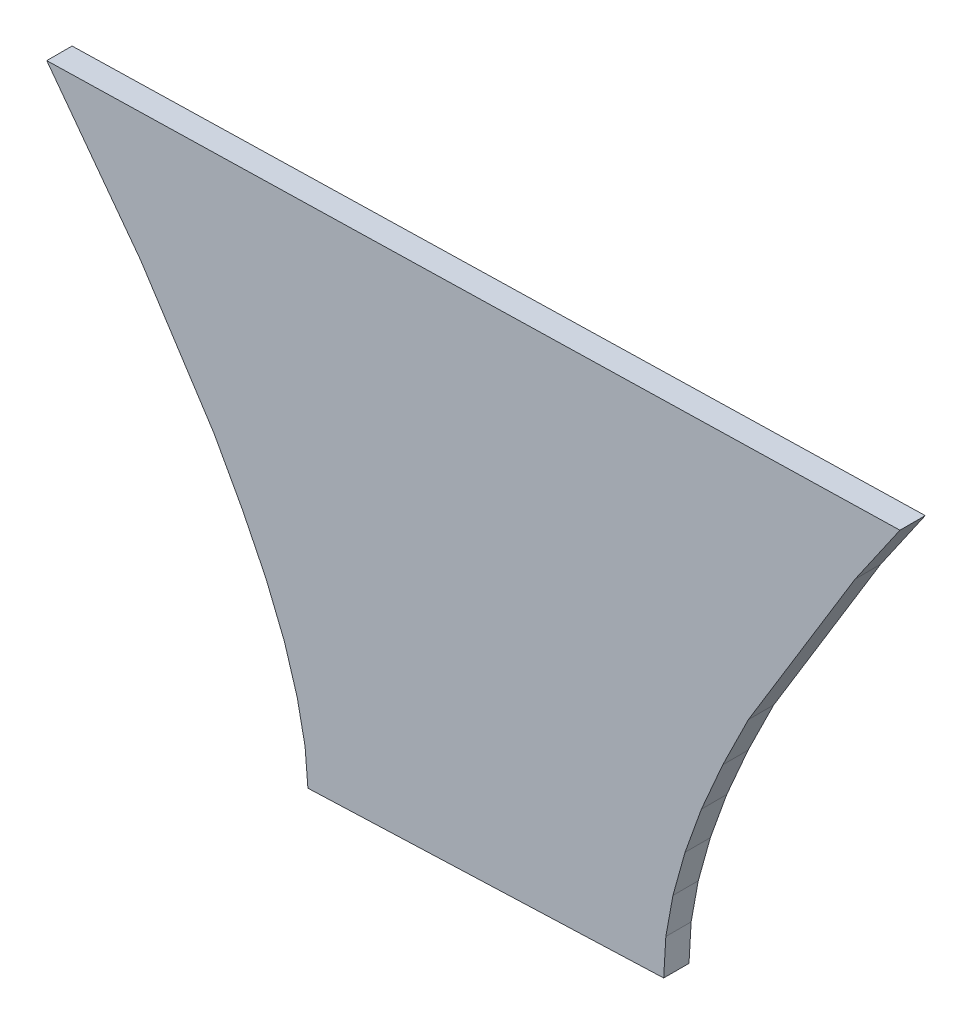
ISO-10303-21;
HEADER;
FILE_DESCRIPTION(('STEP AP214'),'2;1');
FILE_NAME('part.step','',(''),(''),'','','');
FILE_SCHEMA(('AUTOMOTIVE_DESIGN { 1 0 10303 214 1 1 1 1 }'));
ENDSEC;
DATA;
#1=APPLICATION_CONTEXT('core data for automotive mechanical design processes');
#2=APPLICATION_PROTOCOL_DEFINITION('international standard','automotive_design',2000,#1);
#3=PRODUCT_CONTEXT('',#1,'mechanical');
#4=PRODUCT('Part','Part','',(#3));
#5=PRODUCT_RELATED_PRODUCT_CATEGORY('part','',(#4));
#6=PRODUCT_DEFINITION_FORMATION('','',#4);
#7=PRODUCT_DEFINITION_CONTEXT('part definition',#1,'design');
#8=PRODUCT_DEFINITION('design','',#6,#7);
#9=PRODUCT_DEFINITION_SHAPE('','',#8);
#10=(LENGTH_UNIT() NAMED_UNIT(*) SI_UNIT(.MILLI.,.METRE.));
#11=(NAMED_UNIT(*) PLANE_ANGLE_UNIT() SI_UNIT($,.RADIAN.));
#12=(NAMED_UNIT(*) SI_UNIT($,.STERADIAN.) SOLID_ANGLE_UNIT());
#13=UNCERTAINTY_MEASURE_WITH_UNIT(LENGTH_MEASURE(1.E-05),#10,'distance_accuracy_value','');
#14=(GEOMETRIC_REPRESENTATION_CONTEXT(3) GLOBAL_UNCERTAINTY_ASSIGNED_CONTEXT((#13)) GLOBAL_UNIT_ASSIGNED_CONTEXT((#10,
#11,#12)) REPRESENTATION_CONTEXT('',''));
#15=CARTESIAN_POINT('',(0.,0.,0.));
#16=DIRECTION('',(0.,0.,1.));
#17=DIRECTION('',(1.,0.,0.));
#18=AXIS2_PLACEMENT_3D('',#15,#16,#17);
#19=CARTESIAN_POINT('',(50.9290008544922,93.0210037231445,0.));
#20=DIRECTION('',(-0.998341399253956,0.0575712648432582,0.));
#21=DIRECTION('',(0.0575712648432582,0.998341399253956,0.));
#22=AXIS2_PLACEMENT_3D('',#19,#20,#21);
#23=PLANE('',#22);
#24=DIRECTION('',(0.0575712648432582,0.998341399253956,0.));
#25=VECTOR('',#24,1.);
#26=CARTESIAN_POINT('',(50.9290008544922,93.0210037231445,0.03556));
#27=LINE('',#26,#25);
#28=CARTESIAN_POINT('',(50.9290008544922,93.0210037231445,0.03556));
#29=VERTEX_POINT('',#28);
#30=CARTESIAN_POINT('',(50.931999206543,93.072998046875,0.03556));
#31=VERTEX_POINT('',#30);
#32=EDGE_CURVE('E11',#29,#31,#27,.T.);
#33=ORIENTED_EDGE('',*,*,#32,.F.);
#34=DIRECTION('',(0.,0.,1.));
#35=VECTOR('',#34,1.);
#36=CARTESIAN_POINT('',(50.9290008544922,93.0210037231445,0.));
#37=LINE('',#36,#35);
#38=CARTESIAN_POINT('',(50.9290008544922,93.0210037231445,0.));
#39=VERTEX_POINT('',#38);
#40=EDGE_CURVE('E24',#39,#29,#37,.T.);
#41=ORIENTED_EDGE('',*,*,#40,.F.);
#42=DIRECTION('',(0.0575712648432582,0.998341399253956,0.));
#43=VECTOR('',#42,1.);
#44=CARTESIAN_POINT('',(50.9290008544922,93.0210037231445,0.));
#45=LINE('',#44,#43);
#46=CARTESIAN_POINT('',(50.931999206543,93.072998046875,0.));
#47=VERTEX_POINT('',#46);
#48=EDGE_CURVE('E160',#39,#47,#45,.T.);
#49=ORIENTED_EDGE('',*,*,#48,.T.);
#50=DIRECTION('',(0.,0.,1.));
#51=VECTOR('',#50,1.);
#52=CARTESIAN_POINT('',(50.931999206543,93.072998046875,0.));
#53=LINE('',#52,#51);
#54=EDGE_CURVE('E37',#47,#31,#53,.T.);
#55=ORIENTED_EDGE('',*,*,#54,.T.);
#56=EDGE_LOOP('',(#33,#41,#49,#55));
#57=FACE_BOUND('',#56,.T.);
#58=ADVANCED_FACE('F17',(#57),#23,.F.);
#59=CARTESIAN_POINT('',(50.931999206543,93.072998046875,0.));
#60=DIRECTION('',(-0.983863358539756,0.178921468032407,0.));
#61=DIRECTION('',(0.178921468032407,0.983863358539756,0.));
#62=AXIS2_PLACEMENT_3D('',#59,#60,#61);
#63=PLANE('',#62);
#64=DIRECTION('',(0.178921468032407,0.983863358539756,0.));
#65=VECTOR('',#64,1.);
#66=CARTESIAN_POINT('',(50.931999206543,93.072998046875,0.03556));
#67=LINE('',#66,#65);
#68=CARTESIAN_POINT('',(50.9420013427734,93.1279983520508,0.03556));
#69=VERTEX_POINT('',#68);
#70=EDGE_CURVE('E280',#31,#69,#67,.T.);
#71=ORIENTED_EDGE('',*,*,#70,.F.);
#72=ORIENTED_EDGE('',*,*,#54,.F.);
#73=DIRECTION('',(0.178921468032407,0.983863358539756,0.));
#74=VECTOR('',#73,1.);
#75=CARTESIAN_POINT('',(50.931999206543,93.072998046875,0.));
#76=LINE('',#75,#74);
#77=CARTESIAN_POINT('',(50.9420013427734,93.1279983520508,0.));
#78=VERTEX_POINT('',#77);
#79=EDGE_CURVE('E277',#47,#78,#76,.T.);
#80=ORIENTED_EDGE('',*,*,#79,.T.);
#81=DIRECTION('',(0.,0.,1.));
#82=VECTOR('',#81,1.);
#83=CARTESIAN_POINT('',(50.9420013427734,93.1279983520508,0.));
#84=LINE('',#83,#82);
#85=EDGE_CURVE('E275',#78,#69,#84,.T.);
#86=ORIENTED_EDGE('',*,*,#85,.T.);
#87=EDGE_LOOP('',(#71,#72,#80,#86));
#88=FACE_BOUND('',#87,.T.);
#89=ADVANCED_FACE('F288',(#88),#63,.F.);
#90=CARTESIAN_POINT('',(50.9420013427734,93.1279983520508,0.));
#91=DIRECTION('',(-0.963303580445279,0.268414254281151,0.));
#92=DIRECTION('',(0.268414254281151,0.963303580445279,0.));
#93=AXIS2_PLACEMENT_3D('',#90,#91,#92);
#94=PLANE('',#93);
#95=DIRECTION('',(0.268414254281151,0.963303580445279,0.));
#96=VECTOR('',#95,1.);
#97=CARTESIAN_POINT('',(50.9420013427734,93.1279983520508,0.03556));
#98=LINE('',#97,#96);
#99=CARTESIAN_POINT('',(50.9589996337891,93.1890029907227,0.03556));
#100=VERTEX_POINT('',#99);
#101=EDGE_CURVE('E272',#69,#100,#98,.T.);
#102=ORIENTED_EDGE('',*,*,#101,.F.);
#103=ORIENTED_EDGE('',*,*,#85,.F.);
#104=DIRECTION('',(0.268414254281151,0.963303580445279,0.));
#105=VECTOR('',#104,1.);
#106=CARTESIAN_POINT('',(50.9420013427734,93.1279983520508,0.));
#107=LINE('',#106,#105);
#108=CARTESIAN_POINT('',(50.9589996337891,93.1890029907227,0.));
#109=VERTEX_POINT('',#108);
#110=EDGE_CURVE('E269',#78,#109,#107,.T.);
#111=ORIENTED_EDGE('',*,*,#110,.T.);
#112=DIRECTION('',(0.,0.,1.));
#113=VECTOR('',#112,1.);
#114=CARTESIAN_POINT('',(50.9589996337891,93.1890029907227,0.));
#115=LINE('',#114,#113);
#116=EDGE_CURVE('E267',#109,#100,#115,.T.);
#117=ORIENTED_EDGE('',*,*,#116,.T.);
#118=EDGE_LOOP('',(#102,#103,#111,#117));
#119=FACE_BOUND('',#118,.T.);
#120=ADVANCED_FACE('F294',(#119),#94,.F.);
#121=CARTESIAN_POINT('',(50.9589996337891,93.1890029907227,0.));
#122=DIRECTION('',(-0.941072484534248,0.338204936174117,0.));
#123=DIRECTION('',(0.338204936174117,0.941072484534248,0.));
#124=AXIS2_PLACEMENT_3D('',#121,#122,#123);
#125=PLANE('',#124);
#126=DIRECTION('',(0.338204936174117,0.941072484534248,0.));
#127=VECTOR('',#126,1.);
#128=CARTESIAN_POINT('',(50.9589996337891,93.1890029907227,0.03556));
#129=LINE('',#128,#127);
#130=CARTESIAN_POINT('',(50.9819984436035,93.2529983520508,0.03556));
#131=VERTEX_POINT('',#130);
#132=EDGE_CURVE('E264',#100,#131,#129,.T.);
#133=ORIENTED_EDGE('',*,*,#132,.F.);
#134=ORIENTED_EDGE('',*,*,#116,.F.);
#135=DIRECTION('',(0.338204936174117,0.941072484534248,0.));
#136=VECTOR('',#135,1.);
#137=CARTESIAN_POINT('',(50.9589996337891,93.1890029907227,0.));
#138=LINE('',#137,#136);
#139=CARTESIAN_POINT('',(50.9819984436035,93.2529983520508,0.));
#140=VERTEX_POINT('',#139);
#141=EDGE_CURVE('E261',#109,#140,#138,.T.);
#142=ORIENTED_EDGE('',*,*,#141,.T.);
#143=DIRECTION('',(0.,0.,1.));
#144=VECTOR('',#143,1.);
#145=CARTESIAN_POINT('',(50.9819984436035,93.2529983520508,0.));
#146=LINE('',#145,#144);
#147=EDGE_CURVE('E259',#140,#131,#146,.T.);
#148=ORIENTED_EDGE('',*,*,#147,.T.);
#149=EDGE_LOOP('',(#133,#134,#142,#148));
#150=FACE_BOUND('',#149,.T.);
#151=ADVANCED_FACE('F296',(#150),#125,.F.);
#152=CARTESIAN_POINT('',(50.9819984436035,93.2529983520508,0.));
#153=DIRECTION('',(-0.917057965259508,0.398753919546994,0.));
#154=DIRECTION('',(0.398753919546994,0.917057965259508,0.));
#155=AXIS2_PLACEMENT_3D('',#152,#153,#154);
#156=PLANE('',#155);
#157=DIRECTION('',(0.398753919546994,0.917057965259508,0.));
#158=VECTOR('',#157,1.);
#159=CARTESIAN_POINT('',(50.9819984436035,93.2529983520508,0.03556));
#160=LINE('',#159,#158);
#161=CARTESIAN_POINT('',(51.0120010375977,93.3219985961914,0.03556));
#162=VERTEX_POINT('',#161);
#163=EDGE_CURVE('E256',#131,#162,#160,.T.);
#164=ORIENTED_EDGE('',*,*,#163,.F.);
#165=ORIENTED_EDGE('',*,*,#147,.F.);
#166=DIRECTION('',(0.398753919546994,0.917057965259508,0.));
#167=VECTOR('',#166,1.);
#168=CARTESIAN_POINT('',(50.9819984436035,93.2529983520508,0.));
#169=LINE('',#168,#167);
#170=CARTESIAN_POINT('',(51.0120010375977,93.3219985961914,0.));
#171=VERTEX_POINT('',#170);
#172=EDGE_CURVE('E253',#140,#171,#169,.T.);
#173=ORIENTED_EDGE('',*,*,#172,.T.);
#174=DIRECTION('',(0.,0.,1.));
#175=VECTOR('',#174,1.);
#176=CARTESIAN_POINT('',(51.0120010375977,93.3219985961914,0.));
#177=LINE('',#176,#175);
#178=EDGE_CURVE('E251',#171,#162,#177,.T.);
#179=ORIENTED_EDGE('',*,*,#178,.T.);
#180=EDGE_LOOP('',(#164,#165,#173,#179));
#181=FACE_BOUND('',#180,.T.);
#182=ADVANCED_FACE('F301',(#181),#156,.F.);
#183=CARTESIAN_POINT('',(51.0120010375977,93.3219985961914,0.));
#184=DIRECTION('',(-0.896869597174095,0.44229506629034,0.));
#185=DIRECTION('',(0.44229506629034,0.896869597174095,0.));
#186=AXIS2_PLACEMENT_3D('',#183,#184,#185);
#187=PLANE('',#186);
#188=DIRECTION('',(0.44229506629034,0.896869597174095,0.));
#189=VECTOR('',#188,1.);
#190=CARTESIAN_POINT('',(51.0120010375977,93.3219985961914,0.03556));
#191=LINE('',#190,#189);
#192=CARTESIAN_POINT('',(51.0480003356934,93.3949966430664,0.03556));
#193=VERTEX_POINT('',#192);
#194=EDGE_CURVE('E248',#162,#193,#191,.T.);
#195=ORIENTED_EDGE('',*,*,#194,.F.);
#196=ORIENTED_EDGE('',*,*,#178,.F.);
#197=DIRECTION('',(0.44229506629034,0.896869597174095,0.));
#198=VECTOR('',#197,1.);
#199=CARTESIAN_POINT('',(51.0120010375977,93.3219985961914,0.));
#200=LINE('',#199,#198);
#201=CARTESIAN_POINT('',(51.0480003356934,93.3949966430664,0.));
#202=VERTEX_POINT('',#201);
#203=EDGE_CURVE('E245',#171,#202,#200,.T.);
#204=ORIENTED_EDGE('',*,*,#203,.T.);
#205=DIRECTION('',(0.,0.,1.));
#206=VECTOR('',#205,1.);
#207=CARTESIAN_POINT('',(51.0480003356934,93.3949966430664,0.));
#208=LINE('',#207,#206);
#209=EDGE_CURVE('E243',#202,#193,#208,.T.);
#210=ORIENTED_EDGE('',*,*,#209,.T.);
#211=EDGE_LOOP('',(#195,#196,#204,#210));
#212=FACE_BOUND('',#211,.T.);
#213=ADVANCED_FACE('F304',(#212),#187,.F.);
#214=CARTESIAN_POINT('',(51.0480003356934,93.3949966430664,0.));
#215=DIRECTION('',(-0.8537958887252,0.520607895057256,0.));
#216=DIRECTION('',(0.520607895057256,0.8537958887252,0.));
#217=AXIS2_PLACEMENT_3D('',#214,#215,#216);
#218=PLANE('',#217);
#219=DIRECTION('',(0.520607895057256,0.8537958887252,0.));
#220=VECTOR('',#219,1.);
#221=CARTESIAN_POINT('',(51.0480003356934,93.3949966430664,0.03556));
#222=LINE('',#221,#220);
#223=CARTESIAN_POINT('',(51.1980018615723,93.640998840332,0.03556));
#224=VERTEX_POINT('',#223);
#225=EDGE_CURVE('E240',#193,#224,#222,.T.);
#226=ORIENTED_EDGE('',*,*,#225,.F.);
#227=ORIENTED_EDGE('',*,*,#209,.F.);
#228=DIRECTION('',(0.520607895057256,0.8537958887252,0.));
#229=VECTOR('',#228,1.);
#230=CARTESIAN_POINT('',(51.0480003356934,93.3949966430664,0.));
#231=LINE('',#230,#229);
#232=CARTESIAN_POINT('',(51.1980018615723,93.640998840332,0.));
#233=VERTEX_POINT('',#232);
#234=EDGE_CURVE('E237',#202,#233,#231,.T.);
#235=ORIENTED_EDGE('',*,*,#234,.T.);
#236=DIRECTION('',(0.,0.,1.));
#237=VECTOR('',#236,1.);
#238=CARTESIAN_POINT('',(51.1980018615723,93.640998840332,0.));
#239=LINE('',#238,#237);
#240=EDGE_CURVE('E235',#233,#224,#239,.T.);
#241=ORIENTED_EDGE('',*,*,#240,.T.);
#242=EDGE_LOOP('',(#226,#227,#235,#241));
#243=FACE_BOUND('',#242,.T.);
#244=ADVANCED_FACE('F309',(#243),#218,.F.);
#245=CARTESIAN_POINT('',(51.1980018615723,93.640998840332,0.));
#246=DIRECTION('',(-0.822203358231373,0.569193848976825,0.));
#247=DIRECTION('',(0.569193848976825,0.822203358231373,0.));
#248=AXIS2_PLACEMENT_3D('',#245,#246,#247);
#249=PLANE('',#248);
#250=DIRECTION('',(0.569193848976825,0.822203358231373,0.));
#251=VECTOR('',#250,1.);
#252=CARTESIAN_POINT('',(51.1980018615723,93.640998840332,0.03556));
#253=LINE('',#252,#251);
#254=CARTESIAN_POINT('',(51.2610015869141,93.7320022583008,0.03556));
#255=VERTEX_POINT('',#254);
#256=EDGE_CURVE('E232',#224,#255,#253,.T.);
#257=ORIENTED_EDGE('',*,*,#256,.F.);
#258=ORIENTED_EDGE('',*,*,#240,.F.);
#259=DIRECTION('',(0.569193848976825,0.822203358231373,0.));
#260=VECTOR('',#259,1.);
#261=CARTESIAN_POINT('',(51.1980018615723,93.640998840332,0.));
#262=LINE('',#261,#260);
#263=CARTESIAN_POINT('',(51.2610015869141,93.7320022583008,0.));
#264=VERTEX_POINT('',#263);
#265=EDGE_CURVE('E229',#233,#264,#262,.T.);
#266=ORIENTED_EDGE('',*,*,#265,.T.);
#267=DIRECTION('',(0.,0.,1.));
#268=VECTOR('',#267,1.);
#269=CARTESIAN_POINT('',(51.2610015869141,93.7320022583008,0.));
#270=LINE('',#269,#268);
#271=EDGE_CURVE('E227',#264,#255,#270,.T.);
#272=ORIENTED_EDGE('',*,*,#271,.T.);
#273=EDGE_LOOP('',(#257,#258,#266,#272));
#274=FACE_BOUND('',#273,.T.);
#275=ADVANCED_FACE('F312',(#274),#249,.F.);
#276=CARTESIAN_POINT('',(51.2610015869141,93.7320022583008,0.));
#277=DIRECTION('',(0.0233463015758261,-0.999727437956331,0.));
#278=DIRECTION('',(-0.999727437956331,-0.0233463015758261,0.));
#279=AXIS2_PLACEMENT_3D('',#276,#277,#278);
#280=PLANE('',#279);
#281=DIRECTION('',(-0.999727437956331,-0.0233463015758261,0.));
#282=VECTOR('',#281,1.);
#283=CARTESIAN_POINT('',(51.2610015869141,93.7320022583008,0.03556));
#284=LINE('',#283,#282);
#285=CARTESIAN_POINT('',(50.0620002746582,93.7040023803711,0.03556));
#286=VERTEX_POINT('',#285);
#287=EDGE_CURVE('E224',#255,#286,#284,.T.);
#288=ORIENTED_EDGE('',*,*,#287,.F.);
#289=ORIENTED_EDGE('',*,*,#271,.F.);
#290=DIRECTION('',(-0.999727437956331,-0.0233463015758261,0.));
#291=VECTOR('',#290,1.);
#292=CARTESIAN_POINT('',(51.2610015869141,93.7320022583008,0.));
#293=LINE('',#292,#291);
#294=CARTESIAN_POINT('',(50.0620002746582,93.7040023803711,0.));
#295=VERTEX_POINT('',#294);
#296=EDGE_CURVE('E221',#264,#295,#293,.T.);
#297=ORIENTED_EDGE('',*,*,#296,.T.);
#298=DIRECTION('',(0.,0.,1.));
#299=VECTOR('',#298,1.);
#300=CARTESIAN_POINT('',(50.0620002746582,93.7040023803711,0.));
#301=LINE('',#300,#299);
#302=EDGE_CURVE('E219',#295,#286,#301,.T.);
#303=ORIENTED_EDGE('',*,*,#302,.T.);
#304=EDGE_LOOP('',(#288,#289,#297,#303));
#305=FACE_BOUND('',#304,.T.);
#306=ADVANCED_FACE('F317',(#305),#280,.F.);
#307=CARTESIAN_POINT('',(50.0620002746582,93.7040023803711,0.));
#308=DIRECTION('',(0.80163070266898,0.597819551820144,0.));
#309=DIRECTION('',(0.597819551820144,-0.80163070266898,0.));
#310=AXIS2_PLACEMENT_3D('',#307,#308,#309);
#311=PLANE('',#310);
#312=DIRECTION('',(0.597819551820144,-0.80163070266898,0.));
#313=VECTOR('',#312,1.);
#314=CARTESIAN_POINT('',(50.0620002746582,93.7040023803711,0.03556));
#315=LINE('',#314,#313);
#316=CARTESIAN_POINT('',(50.1940002441406,93.5270004272461,0.03556));
#317=VERTEX_POINT('',#316);
#318=EDGE_CURVE('E216',#286,#317,#315,.T.);
#319=ORIENTED_EDGE('',*,*,#318,.F.);
#320=ORIENTED_EDGE('',*,*,#302,.F.);
#321=DIRECTION('',(0.597819551820144,-0.80163070266898,0.));
#322=VECTOR('',#321,1.);
#323=CARTESIAN_POINT('',(50.0620002746582,93.7040023803711,0.));
#324=LINE('',#323,#322);
#325=CARTESIAN_POINT('',(50.1940002441406,93.5270004272461,0.));
#326=VERTEX_POINT('',#325);
#327=EDGE_CURVE('E213',#295,#326,#324,.T.);
#328=ORIENTED_EDGE('',*,*,#327,.T.);
#329=DIRECTION('',(0.,0.,1.));
#330=VECTOR('',#329,1.);
#331=CARTESIAN_POINT('',(50.1940002441406,93.5270004272461,0.));
#332=LINE('',#331,#330);
#333=EDGE_CURVE('E211',#326,#317,#332,.T.);
#334=ORIENTED_EDGE('',*,*,#333,.T.);
#335=EDGE_LOOP('',(#319,#320,#328,#334));
#336=FACE_BOUND('',#335,.T.);
#337=ADVANCED_FACE('F320',(#336),#311,.F.);
#338=CARTESIAN_POINT('',(50.1940002441406,93.5270004272461,0.));
#339=DIRECTION('',(0.839291832075735,0.543681175516456,0.));
#340=DIRECTION('',(0.543681175516456,-0.839291832075735,0.));
#341=AXIS2_PLACEMENT_3D('',#338,#339,#340);
#342=PLANE('',#341);
#343=DIRECTION('',(0.543681175516456,-0.839291832075735,0.));
#344=VECTOR('',#343,1.);
#345=CARTESIAN_POINT('',(50.1940002441406,93.5270004272461,0.03556));
#346=LINE('',#345,#344);
#347=CARTESIAN_POINT('',(50.2970008850098,93.3679962158203,0.03556));
#348=VERTEX_POINT('',#347);
#349=EDGE_CURVE('E208',#317,#348,#346,.T.);
#350=ORIENTED_EDGE('',*,*,#349,.F.);
#351=ORIENTED_EDGE('',*,*,#333,.F.);
#352=DIRECTION('',(0.543681175516456,-0.839291832075735,0.));
#353=VECTOR('',#352,1.);
#354=CARTESIAN_POINT('',(50.1940002441406,93.5270004272461,0.));
#355=LINE('',#354,#353);
#356=CARTESIAN_POINT('',(50.2970008850098,93.3679962158203,0.));
#357=VERTEX_POINT('',#356);
#358=EDGE_CURVE('E205',#326,#357,#355,.T.);
#359=ORIENTED_EDGE('',*,*,#358,.T.);
#360=DIRECTION('',(0.,0.,1.));
#361=VECTOR('',#360,1.);
#362=CARTESIAN_POINT('',(50.2970008850098,93.3679962158203,0.));
#363=LINE('',#362,#361);
#364=EDGE_CURVE('E203',#357,#348,#363,.T.);
#365=ORIENTED_EDGE('',*,*,#364,.T.);
#366=EDGE_LOOP('',(#350,#351,#359,#365));
#367=FACE_BOUND('',#366,.T.);
#368=ADVANCED_FACE('F325',(#367),#342,.F.);
#369=CARTESIAN_POINT('',(50.2970008850098,93.3679962158203,0.));
#370=DIRECTION('',(0.876965686440801,0.480552998955803,0.));
#371=DIRECTION('',(0.480552998955803,-0.876965686440801,0.));
#372=AXIS2_PLACEMENT_3D('',#369,#370,#371);
#373=PLANE('',#372);
#374=DIRECTION('',(0.480552998955802,-0.876965686440801,0.));
#375=VECTOR('',#374,1.);
#376=CARTESIAN_POINT('',(50.2970008850098,93.3679962158203,0.03556));
#377=LINE('',#376,#375);
#378=CARTESIAN_POINT('',(50.3370018005371,93.2949981689453,0.03556));
#379=VERTEX_POINT('',#378);
#380=EDGE_CURVE('E200',#348,#379,#377,.T.);
#381=ORIENTED_EDGE('',*,*,#380,.F.);
#382=ORIENTED_EDGE('',*,*,#364,.F.);
#383=DIRECTION('',(0.480552998955802,-0.876965686440801,0.));
#384=VECTOR('',#383,1.);
#385=CARTESIAN_POINT('',(50.2970008850098,93.3679962158203,0.));
#386=LINE('',#385,#384);
#387=CARTESIAN_POINT('',(50.3370018005371,93.2949981689453,0.));
#388=VERTEX_POINT('',#387);
#389=EDGE_CURVE('E197',#357,#388,#386,.T.);
#390=ORIENTED_EDGE('',*,*,#389,.T.);
#391=DIRECTION('',(0.,0.,1.));
#392=VECTOR('',#391,1.);
#393=CARTESIAN_POINT('',(50.3370018005371,93.2949981689453,0.));
#394=LINE('',#393,#392);
#395=EDGE_CURVE('E195',#388,#379,#394,.T.);
#396=ORIENTED_EDGE('',*,*,#395,.T.);
#397=EDGE_LOOP('',(#381,#382,#390,#396));
#398=FACE_BOUND('',#397,.T.);
#399=ADVANCED_FACE('F328',(#398),#373,.F.);
#400=CARTESIAN_POINT('',(50.3370018005371,93.2949981689453,0.));
#401=DIRECTION('',(0.897107767621295,0.441811784896618,0.));
#402=DIRECTION('',(0.441811784896618,-0.897107767621295,0.));
#403=AXIS2_PLACEMENT_3D('',#400,#401,#402);
#404=PLANE('',#403);
#405=DIRECTION('',(0.441811784896618,-0.897107767621295,0.));
#406=VECTOR('',#405,1.);
#407=CARTESIAN_POINT('',(50.3370018005371,93.2949981689453,0.03556));
#408=LINE('',#407,#406);
#409=CARTESIAN_POINT('',(50.3699989318848,93.2279968261719,0.03556));
#410=VERTEX_POINT('',#409);
#411=EDGE_CURVE('E192',#379,#410,#408,.T.);
#412=ORIENTED_EDGE('',*,*,#411,.F.);
#413=ORIENTED_EDGE('',*,*,#395,.F.);
#414=DIRECTION('',(0.441811784896618,-0.897107767621295,0.));
#415=VECTOR('',#414,1.);
#416=CARTESIAN_POINT('',(50.3370018005371,93.2949981689453,0.));
#417=LINE('',#416,#415);
#418=CARTESIAN_POINT('',(50.3699989318848,93.2279968261719,0.));
#419=VERTEX_POINT('',#418);
#420=EDGE_CURVE('E189',#388,#419,#417,.T.);
#421=ORIENTED_EDGE('',*,*,#420,.T.);
#422=DIRECTION('',(0.,0.,1.));
#423=VECTOR('',#422,1.);
#424=CARTESIAN_POINT('',(50.3699989318848,93.2279968261719,0.));
#425=LINE('',#424,#423);
#426=EDGE_CURVE('E187',#419,#410,#425,.T.);
#427=ORIENTED_EDGE('',*,*,#426,.T.);
#428=EDGE_LOOP('',(#412,#413,#421,#427));
#429=FACE_BOUND('',#428,.T.);
#430=ADVANCED_FACE('F333',(#429),#404,.F.);
#431=CARTESIAN_POINT('',(50.3699989318848,93.2279968261719,0.));
#432=DIRECTION('',(0.926452133729281,0.376412597967261,0.));
#433=DIRECTION('',(0.376412597967261,-0.926452133729281,0.));
#434=AXIS2_PLACEMENT_3D('',#431,#432,#433);
#435=PLANE('',#434);
#436=DIRECTION('',(0.376412597967261,-0.926452133729281,0.));
#437=VECTOR('',#436,1.);
#438=CARTESIAN_POINT('',(50.3699989318848,93.2279968261719,0.03556));
#439=LINE('',#438,#437);
#440=CARTESIAN_POINT('',(50.3959999084473,93.1640014648438,0.03556));
#441=VERTEX_POINT('',#440);
#442=EDGE_CURVE('E184',#410,#441,#439,.T.);
#443=ORIENTED_EDGE('',*,*,#442,.F.);
#444=ORIENTED_EDGE('',*,*,#426,.F.);
#445=DIRECTION('',(0.376412597967261,-0.926452133729281,0.));
#446=VECTOR('',#445,1.);
#447=CARTESIAN_POINT('',(50.3699989318848,93.2279968261719,0.));
#448=LINE('',#447,#446);
#449=CARTESIAN_POINT('',(50.3959999084473,93.1640014648438,0.));
#450=VERTEX_POINT('',#449);
#451=EDGE_CURVE('E181',#419,#450,#448,.T.);
#452=ORIENTED_EDGE('',*,*,#451,.T.);
#453=DIRECTION('',(0.,0.,1.));
#454=VECTOR('',#453,1.);
#455=CARTESIAN_POINT('',(50.3959999084473,93.1640014648438,0.));
#456=LINE('',#455,#454);
#457=EDGE_CURVE('E179',#450,#441,#456,.T.);
#458=ORIENTED_EDGE('',*,*,#457,.T.);
#459=EDGE_LOOP('',(#443,#444,#452,#458));
#460=FACE_BOUND('',#459,.T.);
#461=ADVANCED_FACE('F336',(#460),#435,.F.);
#462=CARTESIAN_POINT('',(50.3959999084473,93.1640014648438,0.));
#463=DIRECTION('',(0.956467675231401,0.291838287819538,0.));
#464=DIRECTION('',(0.291838287819538,-0.956467675231401,0.));
#465=AXIS2_PLACEMENT_3D('',#462,#463,#464);
#466=PLANE('',#465);
#467=DIRECTION('',(0.291838287819538,-0.956467675231401,0.));
#468=VECTOR('',#467,1.);
#469=CARTESIAN_POINT('',(50.3959999084473,93.1640014648438,0.03556));
#470=LINE('',#469,#468);
#471=CARTESIAN_POINT('',(50.4140014648438,93.1050033569336,0.03556));
#472=VERTEX_POINT('',#471);
#473=EDGE_CURVE('E176',#441,#472,#470,.T.);
#474=ORIENTED_EDGE('',*,*,#473,.F.);
#475=ORIENTED_EDGE('',*,*,#457,.F.);
#476=DIRECTION('',(0.291838287819538,-0.956467675231401,0.));
#477=VECTOR('',#476,1.);
#478=CARTESIAN_POINT('',(50.3959999084473,93.1640014648438,0.));
#479=LINE('',#478,#477);
#480=CARTESIAN_POINT('',(50.4140014648438,93.1050033569336,0.));
#481=VERTEX_POINT('',#480);
#482=EDGE_CURVE('E173',#450,#481,#479,.T.);
#483=ORIENTED_EDGE('',*,*,#482,.T.);
#484=DIRECTION('',(0.,0.,1.));
#485=VECTOR('',#484,1.);
#486=CARTESIAN_POINT('',(50.4140014648438,93.1050033569336,0.));
#487=LINE('',#486,#485);
#488=EDGE_CURVE('E171',#481,#472,#487,.T.);
#489=ORIENTED_EDGE('',*,*,#488,.T.);
#490=EDGE_LOOP('',(#474,#475,#483,#489));
#491=FACE_BOUND('',#490,.T.);
#492=ADVANCED_FACE('F341',(#491),#466,.F.);
#493=CARTESIAN_POINT('',(50.4140014648438,93.1050033569336,0.));
#494=DIRECTION('',(0.979885072166908,0.199562635141085,0.));
#495=DIRECTION('',(0.199562635141085,-0.979885072166908,0.));
#496=AXIS2_PLACEMENT_3D('',#493,#494,#495);
#497=PLANE('',#496);
#498=DIRECTION('',(0.199562635141085,-0.979885072166908,0.));
#499=VECTOR('',#498,1.);
#500=CARTESIAN_POINT('',(50.4140014648438,93.1050033569336,0.03556));
#501=LINE('',#500,#499);
#502=CARTESIAN_POINT('',(50.4249992370605,93.0510025024414,0.03556));
#503=VERTEX_POINT('',#502);
#504=EDGE_CURVE('E168',#472,#503,#501,.T.);
#505=ORIENTED_EDGE('',*,*,#504,.F.);
#506=ORIENTED_EDGE('',*,*,#488,.F.);
#507=DIRECTION('',(0.199562635141085,-0.979885072166908,0.));
#508=VECTOR('',#507,1.);
#509=CARTESIAN_POINT('',(50.4140014648438,93.1050033569336,0.));
#510=LINE('',#509,#508);
#511=CARTESIAN_POINT('',(50.4249992370605,93.0510025024414,0.));
#512=VERTEX_POINT('',#511);
#513=EDGE_CURVE('E166',#481,#512,#510,.T.);
#514=ORIENTED_EDGE('',*,*,#513,.T.);
#515=DIRECTION('',(0.,0.,1.));
#516=VECTOR('',#515,1.);
#517=CARTESIAN_POINT('',(50.4249992370605,93.0510025024414,0.));
#518=LINE('',#517,#516);
#519=EDGE_CURVE('E151',#512,#503,#518,.T.);
#520=ORIENTED_EDGE('',*,*,#519,.T.);
#521=EDGE_LOOP('',(#505,#506,#514,#520));
#522=FACE_BOUND('',#521,.T.);
#523=ADVANCED_FACE('F343',(#522),#497,.F.);
#524=CARTESIAN_POINT('',(50.4249992370605,93.0510025024414,0.));
#525=DIRECTION('',(0.996682432627709,0.0813887491691162,0.));
#526=DIRECTION('',(0.0813887491691162,-0.996682432627709,0.));
#527=AXIS2_PLACEMENT_3D('',#524,#525,#526);
#528=PLANE('',#527);
#529=DIRECTION('',(0.0813887491691162,-0.996682432627709,0.));
#530=VECTOR('',#529,1.);
#531=CARTESIAN_POINT('',(50.4249992370605,93.0510025024414,0.03556));
#532=LINE('',#531,#530);
#533=CARTESIAN_POINT('',(50.4290008544922,93.0019989013672,0.03556));
#534=VERTEX_POINT('',#533);
#535=EDGE_CURVE('E155',#503,#534,#532,.T.);
#536=ORIENTED_EDGE('',*,*,#535,.F.);
#537=ORIENTED_EDGE('',*,*,#519,.F.);
#538=DIRECTION('',(0.0813887491691162,-0.996682432627709,0.));
#539=VECTOR('',#538,1.);
#540=CARTESIAN_POINT('',(50.4249992370605,93.0510025024414,0.));
#541=LINE('',#540,#539);
#542=CARTESIAN_POINT('',(50.4290008544922,93.0019989013672,0.));
#543=VERTEX_POINT('',#542);
#544=EDGE_CURVE('E147',#512,#543,#541,.T.);
#545=ORIENTED_EDGE('',*,*,#544,.T.);
#546=DIRECTION('',(0.,0.,1.));
#547=VECTOR('',#546,1.);
#548=CARTESIAN_POINT('',(50.4290008544922,93.0019989013672,0.));
#549=LINE('',#548,#547);
#550=EDGE_CURVE('E137',#543,#534,#549,.T.);
#551=ORIENTED_EDGE('',*,*,#550,.T.);
#552=EDGE_LOOP('',(#536,#537,#545,#551));
#553=FACE_BOUND('',#552,.T.);
#554=ADVANCED_FACE('F150',(#553),#528,.F.);
#555=CARTESIAN_POINT('',(50.4290008544922,93.0019989013672,0.));
#556=DIRECTION('',(-0.0379822163765834,0.999278415277305,0.));
#557=DIRECTION('',(0.999278415277305,0.0379822163765834,0.));
#558=AXIS2_PLACEMENT_3D('',#555,#556,#557);
#559=PLANE('',#558);
#560=DIRECTION('',(0.999278415277305,0.0379822163765834,0.));
#561=VECTOR('',#560,1.);
#562=CARTESIAN_POINT('',(50.4290008544922,93.0019989013672,0.03556));
#563=LINE('',#562,#561);
#564=EDGE_CURVE('E143',#534,#29,#563,.T.);
#565=ORIENTED_EDGE('',*,*,#564,.F.);
#566=ORIENTED_EDGE('',*,*,#550,.F.);
#567=DIRECTION('',(0.999278415277305,0.0379822163765834,0.));
#568=VECTOR('',#567,1.);
#569=CARTESIAN_POINT('',(50.4290008544922,93.0019989013672,0.));
#570=LINE('',#569,#568);
#571=EDGE_CURVE('E141',#543,#39,#570,.T.);
#572=ORIENTED_EDGE('',*,*,#571,.T.);
#573=ORIENTED_EDGE('',*,*,#40,.T.);
#574=EDGE_LOOP('',(#565,#566,#572,#573));
#575=FACE_BOUND('',#574,.T.);
#576=ADVANCED_FACE('F139',(#575),#559,.F.);
#577=CARTESIAN_POINT('',(50.9290008544922,93.0210037231445,0.));
#578=DIRECTION('',(0.,0.,1.));
#579=DIRECTION('',(1.,0.,0.));
#580=AXIS2_PLACEMENT_3D('',#577,#578,#579);
#581=PLANE('',#580);
#582=ORIENTED_EDGE('',*,*,#571,.F.);
#583=ORIENTED_EDGE('',*,*,#544,.F.);
#584=ORIENTED_EDGE('',*,*,#513,.F.);
#585=ORIENTED_EDGE('',*,*,#482,.F.);
#586=ORIENTED_EDGE('',*,*,#451,.F.);
#587=ORIENTED_EDGE('',*,*,#420,.F.);
#588=ORIENTED_EDGE('',*,*,#389,.F.);
#589=ORIENTED_EDGE('',*,*,#358,.F.);
#590=ORIENTED_EDGE('',*,*,#327,.F.);
#591=ORIENTED_EDGE('',*,*,#296,.F.);
#592=ORIENTED_EDGE('',*,*,#265,.F.);
#593=ORIENTED_EDGE('',*,*,#234,.F.);
#594=ORIENTED_EDGE('',*,*,#203,.F.);
#595=ORIENTED_EDGE('',*,*,#172,.F.);
#596=ORIENTED_EDGE('',*,*,#141,.F.);
#597=ORIENTED_EDGE('',*,*,#110,.F.);
#598=ORIENTED_EDGE('',*,*,#79,.F.);
#599=ORIENTED_EDGE('',*,*,#48,.F.);
#600=EDGE_LOOP('',(#582,#583,#584,#585,#586,#587,#588,#589,#590,#591,#592,#593,#594,#595,#596,
#597,#598,#599));
#601=FACE_BOUND('',#600,.T.);
#602=ADVANCED_FACE('F158',(#601),#581,.F.);
#603=CARTESIAN_POINT('',(50.9290008544922,93.0210037231445,0.03556));
#604=DIRECTION('',(0.,0.,1.));
#605=DIRECTION('',(1.,0.,0.));
#606=AXIS2_PLACEMENT_3D('',#603,#604,#605);
#607=PLANE('',#606);
#608=ORIENTED_EDGE('',*,*,#32,.T.);
#609=ORIENTED_EDGE('',*,*,#70,.T.);
#610=ORIENTED_EDGE('',*,*,#101,.T.);
#611=ORIENTED_EDGE('',*,*,#132,.T.);
#612=ORIENTED_EDGE('',*,*,#163,.T.);
#613=ORIENTED_EDGE('',*,*,#194,.T.);
#614=ORIENTED_EDGE('',*,*,#225,.T.);
#615=ORIENTED_EDGE('',*,*,#256,.T.);
#616=ORIENTED_EDGE('',*,*,#287,.T.);
#617=ORIENTED_EDGE('',*,*,#318,.T.);
#618=ORIENTED_EDGE('',*,*,#349,.T.);
#619=ORIENTED_EDGE('',*,*,#380,.T.);
#620=ORIENTED_EDGE('',*,*,#411,.T.);
#621=ORIENTED_EDGE('',*,*,#442,.T.);
#622=ORIENTED_EDGE('',*,*,#473,.T.);
#623=ORIENTED_EDGE('',*,*,#504,.T.);
#624=ORIENTED_EDGE('',*,*,#535,.T.);
#625=ORIENTED_EDGE('',*,*,#564,.T.);
#626=EDGE_LOOP('',(#608,#609,#610,#611,#612,#613,#614,#615,#616,#617,#618,#619,#620,#621,#622,
#623,#624,#625));
#627=FACE_BOUND('',#626,.T.);
#628=ADVANCED_FACE('F291',(#627),#607,.T.);
#629=CLOSED_SHELL('',(#58,#89,#120,#151,#182,#213,#244,#275,#306,#337,#368,#399,#430,#461,#492,
#523,#554,#576,#602,#628));
#630=MANIFOLD_SOLID_BREP('B1',#629);
#631=ADVANCED_BREP_SHAPE_REPRESENTATION('',(#18,#630),#14);
#632=SHAPE_DEFINITION_REPRESENTATION(#9,#631);
ENDSEC;
END-ISO-10303-21;
